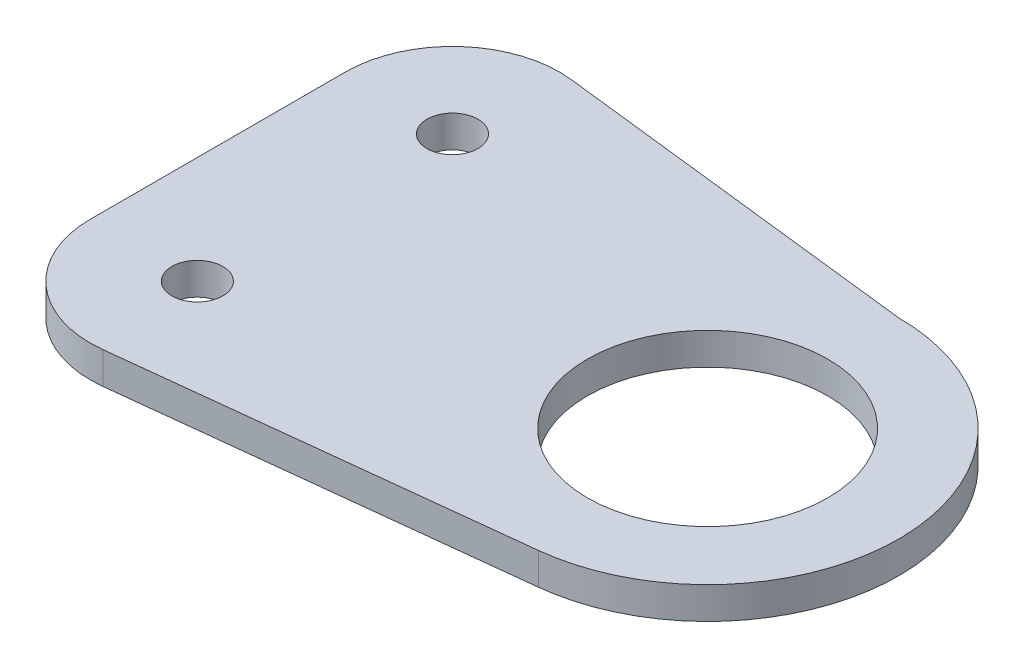
ISO-10303-21;
HEADER;
FILE_DESCRIPTION(('STEP AP214'),'2;1');
FILE_NAME('part.step','',(''),(''),'','','');
FILE_SCHEMA(('AUTOMOTIVE_DESIGN { 1 0 10303 214 1 1 1 1 }'));
ENDSEC;
DATA;
#1=APPLICATION_CONTEXT('core data for automotive mechanical design processes');
#2=APPLICATION_PROTOCOL_DEFINITION('international standard','automotive_design',2000,#1);
#3=PRODUCT_CONTEXT('',#1,'mechanical');
#4=PRODUCT('Part','Part','',(#3));
#5=PRODUCT_RELATED_PRODUCT_CATEGORY('part','',(#4));
#6=PRODUCT_DEFINITION_FORMATION('','',#4);
#7=PRODUCT_DEFINITION_CONTEXT('part definition',#1,'design');
#8=PRODUCT_DEFINITION('design','',#6,#7);
#9=PRODUCT_DEFINITION_SHAPE('','',#8);
#10=(LENGTH_UNIT() NAMED_UNIT(*) SI_UNIT(.MILLI.,.METRE.));
#11=(NAMED_UNIT(*) PLANE_ANGLE_UNIT() SI_UNIT($,.RADIAN.));
#12=(NAMED_UNIT(*) SI_UNIT($,.STERADIAN.) SOLID_ANGLE_UNIT());
#13=UNCERTAINTY_MEASURE_WITH_UNIT(LENGTH_MEASURE(1.E-05),#10,'distance_accuracy_value','');
#14=(GEOMETRIC_REPRESENTATION_CONTEXT(3) GLOBAL_UNCERTAINTY_ASSIGNED_CONTEXT((#13)) GLOBAL_UNIT_ASSIGNED_CONTEXT((#10,
#11,#12)) REPRESENTATION_CONTEXT('',''));
#15=CARTESIAN_POINT('',(0.,0.,0.));
#16=DIRECTION('',(0.,0.,1.));
#17=DIRECTION('',(1.,0.,0.));
#18=AXIS2_PLACEMENT_3D('',#15,#16,#17);
#19=CARTESIAN_POINT('',(-38.0999999999988,3.175,-12.7000000000001));
#20=DIRECTION('',(0.,1.,0.));
#21=DIRECTION('',(0.,0.,1.));
#22=AXIS2_PLACEMENT_3D('',#19,#20,#21);
#23=PLANE('',#22);
#24=CARTESIAN_POINT('',(-38.0999999999988,3.175,-12.7000000000001));
#25=DIRECTION('',(0.,1.,0.));
#26=DIRECTION('',(0.,0.,1.));
#27=AXIS2_PLACEMENT_3D('',#24,#25,#26);
#28=CIRCLE('',#27,2.53999999999881);
#29=CARTESIAN_POINT('',(-38.0999999999988,3.175,-10.1600000000013));
#30=VERTEX_POINT('',#29);
#31=EDGE_CURVE('E190',#30,#30,#28,.T.);
#32=ORIENTED_EDGE('',*,*,#31,.F.);
#33=EDGE_LOOP('',(#32));
#34=FACE_BOUND('',#33,.T.);
#35=CARTESIAN_POINT('',(-38.0999999999988,3.175,-12.7000000000001));
#36=DIRECTION('',(0.,1.,0.));
#37=DIRECTION('',(0.,0.,1.));
#38=AXIS2_PLACEMENT_3D('',#35,#36,#37);
#39=CIRCLE('',#38,10.668);
#40=CARTESIAN_POINT('',(-36.8792812695455,3.175,-23.2979276172808));
#41=VERTEX_POINT('',#40);
#42=CARTESIAN_POINT('',(-48.7679999999988,3.175,-12.7000000000001));
#43=VERTEX_POINT('',#42);
#44=EDGE_CURVE('E135',#41,#43,#39,.T.);
#45=ORIENTED_EDGE('',*,*,#44,.T.);
#46=DIRECTION('',(0.,0.,1.));
#47=VECTOR('',#46,1.);
#48=CARTESIAN_POINT('',(-48.7679999999988,3.175,-12.7000000000001));
#49=LINE('',#48,#47);
#50=CARTESIAN_POINT('',(-48.7679999999988,3.175,12.6999999999999));
#51=VERTEX_POINT('',#50);
#52=EDGE_CURVE('E92',#43,#51,#49,.T.);
#53=ORIENTED_EDGE('',*,*,#52,.T.);
#54=CARTESIAN_POINT('',(-38.0999999999988,3.175,12.6999999999999));
#55=DIRECTION('',(0.,1.,0.));
#56=DIRECTION('',(0.,0.,1.));
#57=AXIS2_PLACEMENT_3D('',#54,#55,#56);
#58=CIRCLE('',#57,10.668);
#59=CARTESIAN_POINT('',(-36.9130394716807,3.175,23.3017615849543));
#60=VERTEX_POINT('',#59);
#61=EDGE_CURVE('E105',#51,#60,#58,.T.);
#62=ORIENTED_EDGE('',*,*,#61,.T.);
#63=DIRECTION('',(0.993790924723884,0.,-0.111263641574628));
#64=VECTOR('',#63,1.);
#65=CARTESIAN_POINT('',(-36.9130394716807,3.175,23.3017615849543));
#66=LINE('',#65,#64);
#67=CARTESIAN_POINT('',(2.11957237199667,3.175,18.93171711599));
#68=VERTEX_POINT('',#67);
#69=EDGE_CURVE('E99',#60,#68,#66,.T.);
#70=ORIENTED_EDGE('',*,*,#69,.T.);
#71=CARTESIAN_POINT('',(0.,3.175,0.));
#72=DIRECTION('',(0.,1.,0.));
#73=DIRECTION('',(0.,0.,1.));
#74=AXIS2_PLACEMENT_3D('',#71,#72,#73);
#75=CIRCLE('',#74,19.05);
#76=CARTESIAN_POINT('',(0.,3.175,-19.05));
#77=VERTEX_POINT('',#76);
#78=EDGE_CURVE('E103',#68,#77,#75,.T.);
#79=ORIENTED_EDGE('',*,*,#78,.T.);
#80=DIRECTION('',(-0.993431535178166,0.,-0.114428077470312));
#81=VECTOR('',#80,1.);
#82=CARTESIAN_POINT('',(-36.8792812695455,3.175,-23.2979276172808));
#83=LINE('',#82,#81);
#84=EDGE_CURVE('E55',#77,#41,#83,.T.);
#85=ORIENTED_EDGE('',*,*,#84,.T.);
#86=EDGE_LOOP('',(#45,#53,#62,#70,#79,#85));
#87=FACE_BOUND('',#86,.T.);
#88=CARTESIAN_POINT('',(0.,3.175,0.));
#89=DIRECTION('',(0.,1.,0.));
#90=DIRECTION('',(0.,0.,1.));
#91=AXIS2_PLACEMENT_3D('',#88,#89,#90);
#92=CIRCLE('',#91,11.96975);
#93=CARTESIAN_POINT('',(0.,3.175,11.96975));
#94=VERTEX_POINT('',#93);
#95=EDGE_CURVE('E128',#94,#94,#92,.T.);
#96=ORIENTED_EDGE('',*,*,#95,.F.);
#97=EDGE_LOOP('',(#96));
#98=FACE_BOUND('',#97,.T.);
#99=CARTESIAN_POINT('',(-38.0999999999988,3.175,12.6999999999999));
#100=DIRECTION('',(0.,1.,0.));
#101=DIRECTION('',(0.,0.,1.));
#102=AXIS2_PLACEMENT_3D('',#99,#100,#101);
#103=CIRCLE('',#102,2.53999999999881);
#104=CARTESIAN_POINT('',(-38.0999999999988,3.175,15.2399999999987));
#105=VERTEX_POINT('',#104);
#106=EDGE_CURVE('E181',#105,#105,#103,.T.);
#107=ORIENTED_EDGE('',*,*,#106,.F.);
#108=EDGE_LOOP('',(#107));
#109=FACE_BOUND('',#108,.T.);
#110=ADVANCED_FACE('F38',(#34,#87,#98,#109),#23,.T.);
#111=CARTESIAN_POINT('',(-38.0999999999988,0.,-12.7000000000001));
#112=DIRECTION('',(0.,1.,0.));
#113=DIRECTION('',(0.,0.,1.));
#114=AXIS2_PLACEMENT_3D('',#111,#112,#113);
#115=PLANE('',#114);
#116=CARTESIAN_POINT('',(-38.0999999999988,0.,-12.7000000000001));
#117=DIRECTION('',(0.,1.,0.));
#118=DIRECTION('',(0.,0.,1.));
#119=AXIS2_PLACEMENT_3D('',#116,#117,#118);
#120=CIRCLE('',#119,10.668);
#121=CARTESIAN_POINT('',(-36.8792812695455,0.,-23.2979276172808));
#122=VERTEX_POINT('',#121);
#123=CARTESIAN_POINT('',(-48.7679999999988,0.,-12.7000000000001));
#124=VERTEX_POINT('',#123);
#125=EDGE_CURVE('E124',#122,#124,#120,.T.);
#126=ORIENTED_EDGE('',*,*,#125,.F.);
#127=DIRECTION('',(-0.993431535178166,0.,-0.114428077470312));
#128=VECTOR('',#127,1.);
#129=CARTESIAN_POINT('',(-36.8792812695455,0.,-23.2979276172808));
#130=LINE('',#129,#128);
#131=CARTESIAN_POINT('',(0.,0.,-19.05));
#132=VERTEX_POINT('',#131);
#133=EDGE_CURVE('E84',#132,#122,#130,.T.);
#134=ORIENTED_EDGE('',*,*,#133,.F.);
#135=CARTESIAN_POINT('',(0.,0.,0.));
#136=DIRECTION('',(0.,1.,0.));
#137=DIRECTION('',(0.,0.,1.));
#138=AXIS2_PLACEMENT_3D('',#135,#136,#137);
#139=CIRCLE('',#138,19.05);
#140=CARTESIAN_POINT('',(2.11957237199667,0.,18.93171711599));
#141=VERTEX_POINT('',#140);
#142=EDGE_CURVE('E78',#141,#132,#139,.T.);
#143=ORIENTED_EDGE('',*,*,#142,.F.);
#144=DIRECTION('',(0.993790924723884,0.,-0.111263641574628));
#145=VECTOR('',#144,1.);
#146=CARTESIAN_POINT('',(-36.9130394716807,0.,23.3017615849543));
#147=LINE('',#146,#145);
#148=CARTESIAN_POINT('',(-36.9130394716807,0.,23.3017615849543));
#149=VERTEX_POINT('',#148);
#150=EDGE_CURVE('E113',#149,#141,#147,.T.);
#151=ORIENTED_EDGE('',*,*,#150,.F.);
#152=CARTESIAN_POINT('',(-38.0999999999988,0.,12.6999999999999));
#153=DIRECTION('',(0.,1.,0.));
#154=DIRECTION('',(0.,0.,1.));
#155=AXIS2_PLACEMENT_3D('',#152,#153,#154);
#156=CIRCLE('',#155,10.668);
#157=CARTESIAN_POINT('',(-48.7679999999988,0.,12.6999999999999));
#158=VERTEX_POINT('',#157);
#159=EDGE_CURVE('E130',#158,#149,#156,.T.);
#160=ORIENTED_EDGE('',*,*,#159,.F.);
#161=DIRECTION('',(0.,0.,1.));
#162=VECTOR('',#161,1.);
#163=CARTESIAN_POINT('',(-48.7679999999988,0.,-12.7000000000001));
#164=LINE('',#163,#162);
#165=EDGE_CURVE('E127',#124,#158,#164,.T.);
#166=ORIENTED_EDGE('',*,*,#165,.F.);
#167=EDGE_LOOP('',(#126,#134,#143,#151,#160,#166));
#168=FACE_BOUND('',#167,.T.);
#169=CARTESIAN_POINT('',(0.,0.,0.));
#170=DIRECTION('',(0.,1.,0.));
#171=DIRECTION('',(0.,0.,1.));
#172=AXIS2_PLACEMENT_3D('',#169,#170,#171);
#173=CIRCLE('',#172,11.96975);
#174=CARTESIAN_POINT('',(0.,0.,11.96975));
#175=VERTEX_POINT('',#174);
#176=EDGE_CURVE('E193',#175,#175,#173,.T.);
#177=ORIENTED_EDGE('',*,*,#176,.T.);
#178=EDGE_LOOP('',(#177));
#179=FACE_BOUND('',#178,.T.);
#180=CARTESIAN_POINT('',(-38.0999999999988,0.,-12.7000000000001));
#181=DIRECTION('',(0.,1.,0.));
#182=DIRECTION('',(0.,0.,1.));
#183=AXIS2_PLACEMENT_3D('',#180,#181,#182);
#184=CIRCLE('',#183,2.53999999999881);
#185=CARTESIAN_POINT('',(-38.0999999999988,0.,-10.1600000000013));
#186=VERTEX_POINT('',#185);
#187=EDGE_CURVE('E187',#186,#186,#184,.T.);
#188=ORIENTED_EDGE('',*,*,#187,.T.);
#189=EDGE_LOOP('',(#188));
#190=FACE_BOUND('',#189,.T.);
#191=CARTESIAN_POINT('',(-38.0999999999988,0.,12.6999999999999));
#192=DIRECTION('',(0.,1.,0.));
#193=DIRECTION('',(0.,0.,1.));
#194=AXIS2_PLACEMENT_3D('',#191,#192,#193);
#195=CIRCLE('',#194,2.53999999999881);
#196=CARTESIAN_POINT('',(-38.0999999999988,0.,15.2399999999987));
#197=VERTEX_POINT('',#196);
#198=EDGE_CURVE('E184',#197,#197,#195,.T.);
#199=ORIENTED_EDGE('',*,*,#198,.T.);
#200=EDGE_LOOP('',(#199));
#201=FACE_BOUND('',#200,.T.);
#202=ADVANCED_FACE('F144',(#168,#179,#190,#201),#115,.F.);
#203=CARTESIAN_POINT('',(-38.0999999999988,3.175,-12.7000000000001));
#204=DIRECTION('',(0.,-1.,0.));
#205=DIRECTION('',(0.,0.,-1.));
#206=AXIS2_PLACEMENT_3D('',#203,#204,#205);
#207=CYLINDRICAL_SURFACE('',#206,10.668);
#208=ORIENTED_EDGE('',*,*,#125,.T.);
#209=DIRECTION('',(0.,-1.,0.));
#210=VECTOR('',#209,1.);
#211=CARTESIAN_POINT('',(-48.7679999999988,3.175,-12.7000000000001));
#212=LINE('',#211,#210);
#213=EDGE_CURVE('E12',#43,#124,#212,.T.);
#214=ORIENTED_EDGE('',*,*,#213,.F.);
#215=ORIENTED_EDGE('',*,*,#44,.F.);
#216=DIRECTION('',(0.,-1.,0.));
#217=VECTOR('',#216,1.);
#218=CARTESIAN_POINT('',(-36.8792812695455,3.175,-23.2979276172808));
#219=LINE('',#218,#217);
#220=EDGE_CURVE('E120',#41,#122,#219,.T.);
#221=ORIENTED_EDGE('',*,*,#220,.T.);
#222=EDGE_LOOP('',(#208,#214,#215,#221));
#223=FACE_BOUND('',#222,.T.);
#224=ADVANCED_FACE('F40',(#223),#207,.T.);
#225=CARTESIAN_POINT('',(-48.7679999999988,3.175,-12.7000000000001));
#226=DIRECTION('',(1.,0.,0.));
#227=DIRECTION('',(0.,0.,-1.));
#228=AXIS2_PLACEMENT_3D('',#225,#226,#227);
#229=PLANE('',#228);
#230=ORIENTED_EDGE('',*,*,#165,.T.);
#231=DIRECTION('',(0.,-1.,0.));
#232=VECTOR('',#231,1.);
#233=CARTESIAN_POINT('',(-48.7679999999988,3.175,12.6999999999999));
#234=LINE('',#233,#232);
#235=EDGE_CURVE('E47',#51,#158,#234,.T.);
#236=ORIENTED_EDGE('',*,*,#235,.F.);
#237=ORIENTED_EDGE('',*,*,#52,.F.);
#238=ORIENTED_EDGE('',*,*,#213,.T.);
#239=EDGE_LOOP('',(#230,#236,#237,#238));
#240=FACE_BOUND('',#239,.T.);
#241=ADVANCED_FACE('F249',(#240),#229,.F.);
#242=CARTESIAN_POINT('',(-38.0999999999988,3.175,12.6999999999999));
#243=DIRECTION('',(0.,-1.,0.));
#244=DIRECTION('',(0.,0.,-1.));
#245=AXIS2_PLACEMENT_3D('',#242,#243,#244);
#246=CYLINDRICAL_SURFACE('',#245,10.668);
#247=ORIENTED_EDGE('',*,*,#159,.T.);
#248=DIRECTION('',(0.,-1.,0.));
#249=VECTOR('',#248,1.);
#250=CARTESIAN_POINT('',(-36.9130394716807,3.175,23.3017615849543));
#251=LINE('',#250,#249);
#252=EDGE_CURVE('E114',#60,#149,#251,.T.);
#253=ORIENTED_EDGE('',*,*,#252,.F.);
#254=ORIENTED_EDGE('',*,*,#61,.F.);
#255=ORIENTED_EDGE('',*,*,#235,.T.);
#256=EDGE_LOOP('',(#247,#253,#254,#255));
#257=FACE_BOUND('',#256,.T.);
#258=ADVANCED_FACE('F141',(#257),#246,.T.);
#259=CARTESIAN_POINT('',(-36.9130394716807,3.175,23.3017615849543));
#260=DIRECTION('',(-0.111263641574628,0.,-0.993790924723884));
#261=DIRECTION('',(-0.993790924723884,0.,0.111263641574628));
#262=AXIS2_PLACEMENT_3D('',#259,#260,#261);
#263=PLANE('',#262);
#264=ORIENTED_EDGE('',*,*,#150,.T.);
#265=DIRECTION('',(0.,-1.,0.));
#266=VECTOR('',#265,1.);
#267=CARTESIAN_POINT('',(2.11957237199667,3.175,18.93171711599));
#268=LINE('',#267,#266);
#269=EDGE_CURVE('E110',#68,#141,#268,.T.);
#270=ORIENTED_EDGE('',*,*,#269,.F.);
#271=ORIENTED_EDGE('',*,*,#69,.F.);
#272=ORIENTED_EDGE('',*,*,#252,.T.);
#273=EDGE_LOOP('',(#264,#270,#271,#272));
#274=FACE_BOUND('',#273,.T.);
#275=ADVANCED_FACE('F111',(#274),#263,.F.);
#276=CARTESIAN_POINT('',(0.,3.175,0.));
#277=DIRECTION('',(0.,-1.,0.));
#278=DIRECTION('',(0.,0.,-1.));
#279=AXIS2_PLACEMENT_3D('',#276,#277,#278);
#280=CYLINDRICAL_SURFACE('',#279,19.05);
#281=ORIENTED_EDGE('',*,*,#142,.T.);
#282=DIRECTION('',(0.,-1.,0.));
#283=VECTOR('',#282,1.);
#284=CARTESIAN_POINT('',(0.,3.175,-19.05));
#285=LINE('',#284,#283);
#286=EDGE_CURVE('E115',#77,#132,#285,.T.);
#287=ORIENTED_EDGE('',*,*,#286,.F.);
#288=ORIENTED_EDGE('',*,*,#78,.F.);
#289=ORIENTED_EDGE('',*,*,#269,.T.);
#290=EDGE_LOOP('',(#281,#287,#288,#289));
#291=FACE_BOUND('',#290,.T.);
#292=ADVANCED_FACE('F117',(#291),#280,.T.);
#293=CARTESIAN_POINT('',(-36.8792812695455,3.175,-23.2979276172808));
#294=DIRECTION('',(-0.114428077470312,0.,0.993431535178166));
#295=DIRECTION('',(0.993431535178166,0.,0.114428077470312));
#296=AXIS2_PLACEMENT_3D('',#293,#294,#295);
#297=PLANE('',#296);
#298=ORIENTED_EDGE('',*,*,#133,.T.);
#299=ORIENTED_EDGE('',*,*,#220,.F.);
#300=ORIENTED_EDGE('',*,*,#84,.F.);
#301=ORIENTED_EDGE('',*,*,#286,.T.);
#302=EDGE_LOOP('',(#298,#299,#300,#301));
#303=FACE_BOUND('',#302,.T.);
#304=ADVANCED_FACE('F149',(#303),#297,.F.);
#305=CARTESIAN_POINT('',(0.,3.175,0.));
#306=DIRECTION('',(0.,-1.,0.));
#307=DIRECTION('',(0.,0.,-1.));
#308=AXIS2_PLACEMENT_3D('',#305,#306,#307);
#309=CYLINDRICAL_SURFACE('',#308,11.96975);
#310=ORIENTED_EDGE('',*,*,#95,.T.);
#311=EDGE_LOOP('',(#310));
#312=FACE_BOUND('',#311,.T.);
#313=ORIENTED_EDGE('',*,*,#176,.F.);
#314=EDGE_LOOP('',(#313));
#315=FACE_BOUND('',#314,.T.);
#316=ADVANCED_FACE('F151',(#312,#315),#309,.F.);
#317=CARTESIAN_POINT('',(-38.0999999999988,3.175,-12.7000000000001));
#318=DIRECTION('',(0.,-1.,0.));
#319=DIRECTION('',(0.,0.,-1.));
#320=AXIS2_PLACEMENT_3D('',#317,#318,#319);
#321=CYLINDRICAL_SURFACE('',#320,2.53999999999881);
#322=ORIENTED_EDGE('',*,*,#31,.T.);
#323=EDGE_LOOP('',(#322));
#324=FACE_BOUND('',#323,.T.);
#325=ORIENTED_EDGE('',*,*,#187,.F.);
#326=EDGE_LOOP('',(#325));
#327=FACE_BOUND('',#326,.T.);
#328=ADVANCED_FACE('F158',(#324,#327),#321,.F.);
#329=CARTESIAN_POINT('',(-38.0999999999988,3.175,12.6999999999999));
#330=DIRECTION('',(0.,-1.,0.));
#331=DIRECTION('',(0.,0.,-1.));
#332=AXIS2_PLACEMENT_3D('',#329,#330,#331);
#333=CYLINDRICAL_SURFACE('',#332,2.53999999999881);
#334=ORIENTED_EDGE('',*,*,#106,.T.);
#335=EDGE_LOOP('',(#334));
#336=FACE_BOUND('',#335,.T.);
#337=ORIENTED_EDGE('',*,*,#198,.F.);
#338=EDGE_LOOP('',(#337));
#339=FACE_BOUND('',#338,.T.);
#340=ADVANCED_FACE('F173',(#336,#339),#333,.F.);
#341=CLOSED_SHELL('',(#110,#202,#224,#241,#258,#275,#292,#304,#316,#328,#340));
#342=MANIFOLD_SOLID_BREP('B2',#341);
#343=ADVANCED_BREP_SHAPE_REPRESENTATION('',(#18,#342),#14);
#344=SHAPE_DEFINITION_REPRESENTATION(#9,#343);
ENDSEC;
END-ISO-10303-21;
